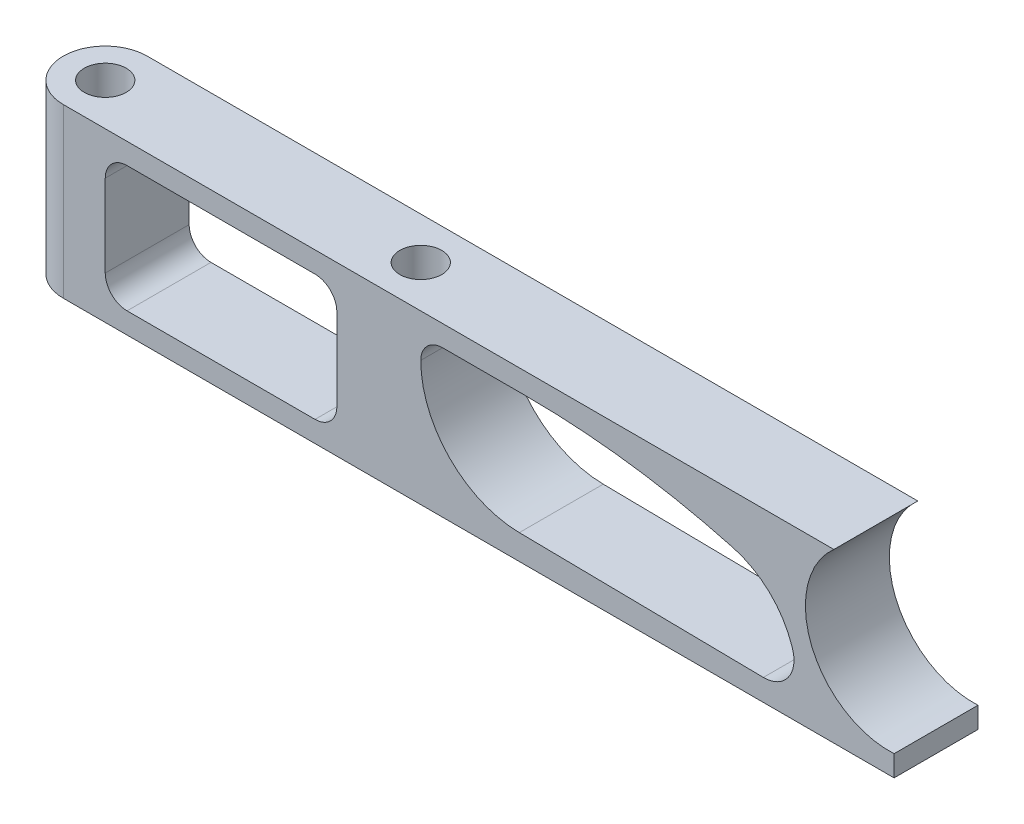
ISO-10303-21;
HEADER;
FILE_DESCRIPTION(('STEP AP214'),'2;1');
FILE_NAME('part.step','',(''),(''),'','','');
FILE_SCHEMA(('AUTOMOTIVE_DESIGN { 1 0 10303 214 1 1 1 1 }'));
ENDSEC;
DATA;
#1=APPLICATION_CONTEXT('core data for automotive mechanical design processes');
#2=APPLICATION_PROTOCOL_DEFINITION('international standard','automotive_design',2000,#1);
#3=PRODUCT_CONTEXT('',#1,'mechanical');
#4=PRODUCT('Part','Part','',(#3));
#5=PRODUCT_RELATED_PRODUCT_CATEGORY('part','',(#4));
#6=PRODUCT_DEFINITION_FORMATION('','',#4);
#7=PRODUCT_DEFINITION_CONTEXT('part definition',#1,'design');
#8=PRODUCT_DEFINITION('design','',#6,#7);
#9=PRODUCT_DEFINITION_SHAPE('','',#8);
#10=(LENGTH_UNIT() NAMED_UNIT(*) SI_UNIT(.MILLI.,.METRE.));
#11=(NAMED_UNIT(*) PLANE_ANGLE_UNIT() SI_UNIT($,.RADIAN.));
#12=(NAMED_UNIT(*) SI_UNIT($,.STERADIAN.) SOLID_ANGLE_UNIT());
#13=UNCERTAINTY_MEASURE_WITH_UNIT(LENGTH_MEASURE(1.E-05),#10,'distance_accuracy_value','');
#14=(GEOMETRIC_REPRESENTATION_CONTEXT(3) GLOBAL_UNCERTAINTY_ASSIGNED_CONTEXT((#13)) GLOBAL_UNIT_ASSIGNED_CONTEXT((#10,
#11,#12)) REPRESENTATION_CONTEXT('',''));
#15=CARTESIAN_POINT('',(0.,0.,0.));
#16=DIRECTION('',(0.,0.,1.));
#17=DIRECTION('',(1.,0.,0.));
#18=AXIS2_PLACEMENT_3D('',#15,#16,#17);
#19=CARTESIAN_POINT('',(0.,0.,12.7));
#20=DIRECTION('',(0.,0.,1.));
#21=DIRECTION('',(1.,0.,0.));
#22=AXIS2_PLACEMENT_3D('',#19,#20,#21);
#23=PLANE('',#22);
#24=DIRECTION('',(-1.,0.,0.));
#25=VECTOR('',#24,1.);
#26=CARTESIAN_POINT('',(-30.1839527027027,11.9142947635135,12.7));
#27=LINE('',#26,#25);
#28=CARTESIAN_POINT('',(94.0565800932726,11.9142947635135,12.7));
#29=VERTEX_POINT('',#28);
#30=CARTESIAN_POINT('',(-22.5639527027027,11.9142947635135,12.7));
#31=VERTEX_POINT('',#30);
#32=EDGE_CURVE('E341',#29,#31,#27,.T.);
#33=ORIENTED_EDGE('',*,*,#32,.T.);
#34=DIRECTION('',(0.,1.,0.));
#35=VECTOR('',#34,1.);
#36=CARTESIAN_POINT('',(-22.5639527027027,-13.4748069239045,12.7));
#37=LINE('',#36,#35);
#38=CARTESIAN_POINT('',(-22.5639527027027,-13.4748069239045,12.7));
#39=VERTEX_POINT('',#38);
#40=EDGE_CURVE('E316',#39,#31,#37,.T.);
#41=ORIENTED_EDGE('',*,*,#40,.F.);
#42=DIRECTION('',(-1.,0.,0.));
#43=VECTOR('',#42,1.);
#44=CARTESIAN_POINT('',(-30.1839527027027,-13.4748069239045,12.7));
#45=LINE('',#44,#43);
#46=CARTESIAN_POINT('',(103.166047297297,-13.4748069239045,12.7));
#47=VERTEX_POINT('',#46);
#48=EDGE_CURVE('E321',#47,#39,#45,.T.);
#49=ORIENTED_EDGE('',*,*,#48,.F.);
#50=DIRECTION('',(0.,1.,0.));
#51=VECTOR('',#50,1.);
#52=CARTESIAN_POINT('',(103.166047297297,11.9142947635135,12.7));
#53=LINE('',#52,#51);
#54=CARTESIAN_POINT('',(103.166047297297,-10.2998069239045,12.7));
#55=VERTEX_POINT('',#54);
#56=EDGE_CURVE('E347',#47,#55,#53,.T.);
#57=ORIENTED_EDGE('',*,*,#56,.T.);
#58=CARTESIAN_POINT('',(102.446023355036,2.37976584186993,12.7));
#59=DIRECTION('',(0.,0.,1.));
#60=DIRECTION('',(1.,0.,0.));
#61=AXIS2_PLACEMENT_3D('',#58,#59,#60);
#62=CIRCLE('',#61,12.7);
#63=EDGE_CURVE('E344',#55,#29,#62,.F.);
#64=ORIENTED_EDGE('',*,*,#63,.T.);
#65=EDGE_LOOP('',(#33,#41,#49,#57,#64));
#66=FACE_BOUND('',#65,.T.);
#67=DIRECTION('',(0.,-1.,0.));
#68=VECTOR('',#67,1.);
#69=CARTESIAN_POINT('',(-16.2139527027027,-6.99780692390455,12.7));
#70=LINE('',#69,#68);
#71=CARTESIAN_POINT('',(-16.2139527027027,5.4372947635135,12.7));
#72=VERTEX_POINT('',#71);
#73=CARTESIAN_POINT('',(-16.2139527027027,-6.99780692390455,12.7));
#74=VERTEX_POINT('',#73);
#75=EDGE_CURVE('E310',#72,#74,#70,.T.);
#76=ORIENTED_EDGE('',*,*,#75,.F.);
#77=CARTESIAN_POINT('',(-12.9119527027027,5.4372947635135,12.7));
#78=DIRECTION('',(0.,0.,1.));
#79=DIRECTION('',(-1.,0.,0.));
#80=AXIS2_PLACEMENT_3D('',#77,#78,#79);
#81=CIRCLE('',#80,3.302);
#82=CARTESIAN_POINT('',(-12.9119527027027,8.7392947635135,12.7));
#83=VERTEX_POINT('',#82);
#84=EDGE_CURVE('E279',#83,#72,#81,.T.);
#85=ORIENTED_EDGE('',*,*,#84,.F.);
#86=DIRECTION('',(-1.,0.,0.));
#87=VECTOR('',#86,1.);
#88=CARTESIAN_POINT('',(-12.9119527027027,8.7392947635135,12.7));
#89=LINE('',#88,#87);
#90=CARTESIAN_POINT('',(15.5360472972973,8.73929476351351,12.7));
#91=VERTEX_POINT('',#90);
#92=EDGE_CURVE('E274',#91,#83,#89,.T.);
#93=ORIENTED_EDGE('',*,*,#92,.F.);
#94=CARTESIAN_POINT('',(15.5360472972973,5.4372947635135,12.7));
#95=DIRECTION('',(0.,0.,1.));
#96=DIRECTION('',(-1.,0.,0.));
#97=AXIS2_PLACEMENT_3D('',#94,#95,#96);
#98=CIRCLE('',#97,3.302);
#99=CARTESIAN_POINT('',(18.8380472972973,5.4372947635135,12.7));
#100=VERTEX_POINT('',#99);
#101=EDGE_CURVE('E300',#100,#91,#98,.T.);
#102=ORIENTED_EDGE('',*,*,#101,.F.);
#103=DIRECTION('',(0.,1.,0.));
#104=VECTOR('',#103,1.);
#105=CARTESIAN_POINT('',(18.8380472972973,5.4372947635135,12.7));
#106=LINE('',#105,#104);
#107=CARTESIAN_POINT('',(18.8380472972973,-6.99780692390455,12.7));
#108=VERTEX_POINT('',#107);
#109=EDGE_CURVE('E302',#108,#100,#106,.T.);
#110=ORIENTED_EDGE('',*,*,#109,.F.);
#111=CARTESIAN_POINT('',(15.5360472972973,-6.99780692390455,12.7));
#112=DIRECTION('',(0.,0.,1.));
#113=DIRECTION('',(-1.,0.,0.));
#114=AXIS2_PLACEMENT_3D('',#111,#112,#113);
#115=CIRCLE('',#114,3.302);
#116=CARTESIAN_POINT('',(15.5360472972973,-10.2998069239046,12.7));
#117=VERTEX_POINT('',#116);
#118=EDGE_CURVE('E304',#117,#108,#115,.T.);
#119=ORIENTED_EDGE('',*,*,#118,.F.);
#120=DIRECTION('',(1.,0.,0.));
#121=VECTOR('',#120,1.);
#122=CARTESIAN_POINT('',(15.5360472972973,-10.2998069239046,12.7));
#123=LINE('',#122,#121);
#124=CARTESIAN_POINT('',(-12.9119527027027,-10.2998069239046,12.7));
#125=VERTEX_POINT('',#124);
#126=EDGE_CURVE('E306',#125,#117,#123,.T.);
#127=ORIENTED_EDGE('',*,*,#126,.F.);
#128=CARTESIAN_POINT('',(-12.9119527027027,-6.99780692390455,12.7));
#129=DIRECTION('',(0.,0.,1.));
#130=DIRECTION('',(-1.,0.,0.));
#131=AXIS2_PLACEMENT_3D('',#128,#129,#130);
#132=CIRCLE('',#131,3.302);
#133=EDGE_CURVE('E308',#74,#125,#132,.T.);
#134=ORIENTED_EDGE('',*,*,#133,.F.);
#135=EDGE_LOOP('',(#76,#85,#93,#102,#110,#119,#127,#134));
#136=FACE_BOUND('',#135,.T.);
#137=CARTESIAN_POINT('',(46.6611345408116,5.43729476351351,12.7));
#138=DIRECTION('',(0.,0.,1.));
#139=DIRECTION('',(1.,0.,0.));
#140=AXIS2_PLACEMENT_3D('',#137,#138,#139);
#141=CIRCLE('',#140,15.1230872435143);
#142=CARTESIAN_POINT('',(31.5380472972973,5.43729476351351,12.7));
#143=VERTEX_POINT('',#142);
#144=CARTESIAN_POINT('',(46.4508885535905,-9.68433095595871,12.7));
#145=VERTEX_POINT('',#144);
#146=EDGE_CURVE('E198',#143,#145,#141,.T.);
#147=ORIENTED_EDGE('',*,*,#146,.F.);
#148=CARTESIAN_POINT('',(34.8400472972973,5.43729476351351,12.7));
#149=DIRECTION('',(0.,0.,1.));
#150=DIRECTION('',(-1.,0.,0.));
#151=AXIS2_PLACEMENT_3D('',#148,#149,#150);
#152=CIRCLE('',#151,3.302);
#153=CARTESIAN_POINT('',(34.8400472972973,8.73929476351351,12.7));
#154=VERTEX_POINT('',#153);
#155=EDGE_CURVE('E188',#154,#143,#152,.T.);
#156=ORIENTED_EDGE('',*,*,#155,.F.);
#157=DIRECTION('',(-1.,0.,0.));
#158=VECTOR('',#157,1.);
#159=CARTESIAN_POINT('',(34.8400472972973,8.73929476351351,12.7));
#160=LINE('',#159,#158);
#161=CARTESIAN_POINT('',(47.3293118483746,8.73929476351351,12.7));
#162=VERTEX_POINT('',#161);
#163=EDGE_CURVE('E223',#162,#154,#160,.T.);
#164=ORIENTED_EDGE('',*,*,#163,.F.);
#165=CARTESIAN_POINT('',(47.3293118483746,-110.62988668612,12.7));
#166=DIRECTION('',(0.,0.,1.));
#167=DIRECTION('',(-1.,0.,0.));
#168=AXIS2_PLACEMENT_3D('',#165,#166,#167);
#169=CIRCLE('',#168,119.369181449633);
#170=CARTESIAN_POINT('',(78.7987085512871,4.51644869243319,12.7));
#171=VERTEX_POINT('',#170);
#172=EDGE_CURVE('E221',#171,#162,#169,.T.);
#173=ORIENTED_EDGE('',*,*,#172,.F.);
#174=CARTESIAN_POINT('',(75.3777675369357,-8.00075413377447,12.7));
#175=DIRECTION('',(0.,0.,1.));
#176=DIRECTION('',(-1.,0.,0.));
#177=AXIS2_PLACEMENT_3D('',#174,#175,#176);
#178=CIRCLE('',#177,12.9762553926814);
#179=CARTESIAN_POINT('',(87.6879743890515,-3.89685217658614,12.7));
#180=VERTEX_POINT('',#179);
#181=EDGE_CURVE('E219',#180,#171,#178,.T.);
#182=ORIENTED_EDGE('',*,*,#181,.F.);
#183=DIRECTION('',(-0.316262421861991,0.948671745398791,0.));
#184=VECTOR('',#183,1.);
#185=CARTESIAN_POINT('',(87.6879743890515,-3.89685217658614,12.7));
#186=LINE('',#185,#184);
#187=CARTESIAN_POINT('',(87.7824661222658,-4.18029286152881,12.7));
#188=VERTEX_POINT('',#187);
#189=EDGE_CURVE('E217',#188,#180,#186,.T.);
#190=ORIENTED_EDGE('',*,*,#189,.F.);
#191=CARTESIAN_POINT('',(83.4451389023025,-5.62624465428155,12.7));
#192=DIRECTION('',(0.,0.,1.));
#193=DIRECTION('',(1.,0.,0.));
#194=AXIS2_PLACEMENT_3D('',#191,#192,#193);
#195=CIRCLE('',#194,4.57200000000001);
#196=CARTESIAN_POINT('',(83.3815774985959,-10.1978028074673,12.7));
#197=VERTEX_POINT('',#196);
#198=EDGE_CURVE('E213',#197,#188,#195,.T.);
#199=ORIENTED_EDGE('',*,*,#198,.F.);
#200=DIRECTION('',(0.999903358089616,-0.0139023192709042,0.));
#201=VECTOR('',#200,1.);
#202=CARTESIAN_POINT('',(46.4508885535905,-9.68433095595871,12.7));
#203=LINE('',#202,#201);
#204=EDGE_CURVE('E211',#145,#197,#203,.T.);
#205=ORIENTED_EDGE('',*,*,#204,.F.);
#206=EDGE_LOOP('',(#147,#156,#164,#173,#182,#190,#199,#205));
#207=FACE_BOUND('',#206,.T.);
#208=ADVANCED_FACE('F43',(#66,#136,#207),#23,.T.);
#209=CARTESIAN_POINT('',(0.,0.,0.));
#210=DIRECTION('',(0.,0.,1.));
#211=DIRECTION('',(1.,0.,0.));
#212=AXIS2_PLACEMENT_3D('',#209,#210,#211);
#213=PLANE('',#212);
#214=CARTESIAN_POINT('',(-12.9119527027027,5.4372947635135,0.));
#215=DIRECTION('',(0.,0.,1.));
#216=DIRECTION('',(-1.,0.,0.));
#217=AXIS2_PLACEMENT_3D('',#214,#215,#216);
#218=CIRCLE('',#217,3.302);
#219=CARTESIAN_POINT('',(-12.9119527027027,8.7392947635135,0.));
#220=VERTEX_POINT('',#219);
#221=CARTESIAN_POINT('',(-16.2139527027027,5.4372947635135,0.));
#222=VERTEX_POINT('',#221);
#223=EDGE_CURVE('E227',#220,#222,#218,.T.);
#224=ORIENTED_EDGE('',*,*,#223,.T.);
#225=DIRECTION('',(0.,-1.,0.));
#226=VECTOR('',#225,1.);
#227=CARTESIAN_POINT('',(-16.2139527027027,-6.99780692390455,0.));
#228=LINE('',#227,#226);
#229=CARTESIAN_POINT('',(-16.2139527027027,-6.99780692390455,0.));
#230=VERTEX_POINT('',#229);
#231=EDGE_CURVE('E294',#222,#230,#228,.T.);
#232=ORIENTED_EDGE('',*,*,#231,.T.);
#233=CARTESIAN_POINT('',(-12.9119527027027,-6.99780692390455,0.));
#234=DIRECTION('',(0.,0.,1.));
#235=DIRECTION('',(-1.,0.,0.));
#236=AXIS2_PLACEMENT_3D('',#233,#234,#235);
#237=CIRCLE('',#236,3.302);
#238=CARTESIAN_POINT('',(-12.9119527027027,-10.2998069239046,0.));
#239=VERTEX_POINT('',#238);
#240=EDGE_CURVE('E291',#230,#239,#237,.T.);
#241=ORIENTED_EDGE('',*,*,#240,.T.);
#242=DIRECTION('',(1.,0.,0.));
#243=VECTOR('',#242,1.);
#244=CARTESIAN_POINT('',(15.5360472972973,-10.2998069239046,0.));
#245=LINE('',#244,#243);
#246=CARTESIAN_POINT('',(15.5360472972973,-10.2998069239046,0.));
#247=VERTEX_POINT('',#246);
#248=EDGE_CURVE('E288',#239,#247,#245,.T.);
#249=ORIENTED_EDGE('',*,*,#248,.T.);
#250=CARTESIAN_POINT('',(15.5360472972973,-6.99780692390455,0.));
#251=DIRECTION('',(0.,0.,1.));
#252=DIRECTION('',(-1.,0.,0.));
#253=AXIS2_PLACEMENT_3D('',#250,#251,#252);
#254=CIRCLE('',#253,3.302);
#255=CARTESIAN_POINT('',(18.8380472972973,-6.99780692390455,0.));
#256=VERTEX_POINT('',#255);
#257=EDGE_CURVE('E285',#247,#256,#254,.T.);
#258=ORIENTED_EDGE('',*,*,#257,.T.);
#259=DIRECTION('',(0.,1.,0.));
#260=VECTOR('',#259,1.);
#261=CARTESIAN_POINT('',(18.8380472972973,5.4372947635135,0.));
#262=LINE('',#261,#260);
#263=CARTESIAN_POINT('',(18.8380472972973,5.4372947635135,0.));
#264=VERTEX_POINT('',#263);
#265=EDGE_CURVE('E282',#256,#264,#262,.T.);
#266=ORIENTED_EDGE('',*,*,#265,.T.);
#267=CARTESIAN_POINT('',(15.5360472972973,5.4372947635135,0.));
#268=DIRECTION('',(0.,0.,1.));
#269=DIRECTION('',(-1.,0.,0.));
#270=AXIS2_PLACEMENT_3D('',#267,#268,#269);
#271=CIRCLE('',#270,3.302);
#272=CARTESIAN_POINT('',(15.5360472972973,8.7392947635135,0.));
#273=VERTEX_POINT('',#272);
#274=EDGE_CURVE('E278',#264,#273,#271,.T.);
#275=ORIENTED_EDGE('',*,*,#274,.T.);
#276=DIRECTION('',(-1.,0.,0.));
#277=VECTOR('',#276,1.);
#278=CARTESIAN_POINT('',(-12.9119527027027,8.7392947635135,0.));
#279=LINE('',#278,#277);
#280=EDGE_CURVE('E275',#273,#220,#279,.T.);
#281=ORIENTED_EDGE('',*,*,#280,.T.);
#282=EDGE_LOOP('',(#224,#232,#241,#249,#258,#266,#275,#281));
#283=FACE_BOUND('',#282,.T.);
#284=DIRECTION('',(0.,1.,0.));
#285=VECTOR('',#284,1.);
#286=CARTESIAN_POINT('',(-22.5639527027027,-13.4748069239045,0.));
#287=LINE('',#286,#285);
#288=CARTESIAN_POINT('',(-22.5639527027027,-13.4748069239045,0.));
#289=VERTEX_POINT('',#288);
#290=CARTESIAN_POINT('',(-22.5639527027027,11.9142947635135,0.));
#291=VERTEX_POINT('',#290);
#292=EDGE_CURVE('E318',#289,#291,#287,.T.);
#293=ORIENTED_EDGE('',*,*,#292,.T.);
#294=DIRECTION('',(-1.,0.,0.));
#295=VECTOR('',#294,1.);
#296=CARTESIAN_POINT('',(-30.1839527027027,11.9142947635135,0.));
#297=LINE('',#296,#295);
#298=CARTESIAN_POINT('',(94.0565800932726,11.9142947635135,0.));
#299=VERTEX_POINT('',#298);
#300=EDGE_CURVE('E353',#299,#291,#297,.T.);
#301=ORIENTED_EDGE('',*,*,#300,.F.);
#302=CARTESIAN_POINT('',(102.446023355036,2.37976584186993,0.));
#303=DIRECTION('',(0.,0.,1.));
#304=DIRECTION('',(1.,0.,0.));
#305=AXIS2_PLACEMENT_3D('',#302,#303,#304);
#306=CIRCLE('',#305,12.7);
#307=CARTESIAN_POINT('',(103.166047297297,-10.2998069239045,0.));
#308=VERTEX_POINT('',#307);
#309=EDGE_CURVE('E52',#308,#299,#306,.F.);
#310=ORIENTED_EDGE('',*,*,#309,.F.);
#311=DIRECTION('',(0.,1.,0.));
#312=VECTOR('',#311,1.);
#313=CARTESIAN_POINT('',(103.166047297297,11.9142947635135,0.));
#314=LINE('',#313,#312);
#315=CARTESIAN_POINT('',(103.166047297297,-13.4748069239045,0.));
#316=VERTEX_POINT('',#315);
#317=EDGE_CURVE('E334',#316,#308,#314,.T.);
#318=ORIENTED_EDGE('',*,*,#317,.F.);
#319=DIRECTION('',(-1.,0.,0.));
#320=VECTOR('',#319,1.);
#321=CARTESIAN_POINT('',(-30.1839527027027,-13.4748069239045,0.));
#322=LINE('',#321,#320);
#323=EDGE_CURVE('E323',#316,#289,#322,.T.);
#324=ORIENTED_EDGE('',*,*,#323,.T.);
#325=EDGE_LOOP('',(#293,#301,#310,#318,#324));
#326=FACE_BOUND('',#325,.T.);
#327=CARTESIAN_POINT('',(34.8400472972973,5.43729476351351,0.));
#328=DIRECTION('',(0.,0.,1.));
#329=DIRECTION('',(-1.,0.,0.));
#330=AXIS2_PLACEMENT_3D('',#327,#328,#329);
#331=CIRCLE('',#330,3.302);
#332=CARTESIAN_POINT('',(34.8400472972973,8.73929476351351,0.));
#333=VERTEX_POINT('',#332);
#334=CARTESIAN_POINT('',(31.5380472972973,5.43729476351351,0.));
#335=VERTEX_POINT('',#334);
#336=EDGE_CURVE('E225',#333,#335,#331,.T.);
#337=ORIENTED_EDGE('',*,*,#336,.T.);
#338=CARTESIAN_POINT('',(46.6611345408116,5.43729476351351,0.));
#339=DIRECTION('',(0.,0.,1.));
#340=DIRECTION('',(1.,0.,0.));
#341=AXIS2_PLACEMENT_3D('',#338,#339,#340);
#342=CIRCLE('',#341,15.1230872435143);
#343=CARTESIAN_POINT('',(46.4508885535905,-9.68433095595871,0.));
#344=VERTEX_POINT('',#343);
#345=EDGE_CURVE('E205',#335,#344,#342,.T.);
#346=ORIENTED_EDGE('',*,*,#345,.T.);
#347=DIRECTION('',(0.999903358089616,-0.0139023192709042,0.));
#348=VECTOR('',#347,1.);
#349=CARTESIAN_POINT('',(46.4508885535905,-9.68433095595871,0.));
#350=LINE('',#349,#348);
#351=CARTESIAN_POINT('',(83.3815774985959,-10.1978028074673,0.));
#352=VERTEX_POINT('',#351);
#353=EDGE_CURVE('E229',#344,#352,#350,.T.);
#354=ORIENTED_EDGE('',*,*,#353,.T.);
#355=CARTESIAN_POINT('',(83.4451389023025,-5.62624465428155,0.));
#356=DIRECTION('',(0.,0.,1.));
#357=DIRECTION('',(1.,0.,0.));
#358=AXIS2_PLACEMENT_3D('',#355,#356,#357);
#359=CIRCLE('',#358,4.57200000000001);
#360=CARTESIAN_POINT('',(87.7824661222658,-4.18029286152881,0.));
#361=VERTEX_POINT('',#360);
#362=EDGE_CURVE('E232',#352,#361,#359,.T.);
#363=ORIENTED_EDGE('',*,*,#362,.T.);
#364=DIRECTION('',(-0.316262421861991,0.948671745398791,0.));
#365=VECTOR('',#364,1.);
#366=CARTESIAN_POINT('',(87.6879743890515,-3.89685217658614,0.));
#367=LINE('',#366,#365);
#368=CARTESIAN_POINT('',(87.6879743890515,-3.89685217658614,0.));
#369=VERTEX_POINT('',#368);
#370=EDGE_CURVE('E235',#361,#369,#367,.T.);
#371=ORIENTED_EDGE('',*,*,#370,.T.);
#372=CARTESIAN_POINT('',(75.3777675369357,-8.00075413377447,0.));
#373=DIRECTION('',(0.,0.,1.));
#374=DIRECTION('',(-1.,0.,0.));
#375=AXIS2_PLACEMENT_3D('',#372,#373,#374);
#376=CIRCLE('',#375,12.9762553926814);
#377=CARTESIAN_POINT('',(78.7987085512871,4.51644869243319,0.));
#378=VERTEX_POINT('',#377);
#379=EDGE_CURVE('E238',#369,#378,#376,.T.);
#380=ORIENTED_EDGE('',*,*,#379,.T.);
#381=CARTESIAN_POINT('',(47.3293118483746,-110.62988668612,0.));
#382=DIRECTION('',(0.,0.,1.));
#383=DIRECTION('',(-1.,0.,0.));
#384=AXIS2_PLACEMENT_3D('',#381,#382,#383);
#385=CIRCLE('',#384,119.369181449633);
#386=CARTESIAN_POINT('',(47.3293118483746,8.73929476351351,0.));
#387=VERTEX_POINT('',#386);
#388=EDGE_CURVE('E241',#378,#387,#385,.T.);
#389=ORIENTED_EDGE('',*,*,#388,.T.);
#390=DIRECTION('',(-1.,0.,0.));
#391=VECTOR('',#390,1.);
#392=CARTESIAN_POINT('',(34.8400472972973,8.73929476351351,0.));
#393=LINE('',#392,#391);
#394=EDGE_CURVE('E199',#387,#333,#393,.T.);
#395=ORIENTED_EDGE('',*,*,#394,.T.);
#396=EDGE_LOOP('',(#337,#346,#354,#363,#371,#380,#389,#395));
#397=FACE_BOUND('',#396,.T.);
#398=ADVANCED_FACE('F366',(#283,#326,#397),#213,.F.);
#399=CARTESIAN_POINT('',(-30.1839527027027,11.9142947635135,12.7));
#400=DIRECTION('',(0.,-1.,0.));
#401=DIRECTION('',(0.,0.,-1.));
#402=AXIS2_PLACEMENT_3D('',#399,#400,#401);
#403=PLANE('',#402);
#404=CARTESIAN_POINT('',(-22.5639527027027,11.9142947635135,6.35));
#405=DIRECTION('',(0.,1.,0.));
#406=DIRECTION('',(0.,0.,1.));
#407=AXIS2_PLACEMENT_3D('',#404,#405,#406);
#408=CIRCLE('',#407,3.175);
#409=CARTESIAN_POINT('',(-22.5639527027027,11.9142947635135,9.525));
#410=VERTEX_POINT('',#409);
#411=EDGE_CURVE('E340',#410,#410,#408,.T.);
#412=ORIENTED_EDGE('',*,*,#411,.F.);
#413=EDGE_LOOP('',(#412));
#414=FACE_BOUND('',#413,.T.);
#415=CARTESIAN_POINT('',(25.1880472972973,11.9142947635135,6.35));
#416=DIRECTION('',(0.,1.,0.));
#417=DIRECTION('',(0.,0.,1.));
#418=AXIS2_PLACEMENT_3D('',#415,#416,#417);
#419=CIRCLE('',#418,3.175);
#420=CARTESIAN_POINT('',(25.1880472972973,11.9142947635135,9.525));
#421=VERTEX_POINT('',#420);
#422=EDGE_CURVE('E337',#421,#421,#419,.T.);
#423=ORIENTED_EDGE('',*,*,#422,.F.);
#424=EDGE_LOOP('',(#423));
#425=FACE_BOUND('',#424,.T.);
#426=ORIENTED_EDGE('',*,*,#300,.T.);
#427=CARTESIAN_POINT('',(-22.5639527027027,11.9142947635135,6.35));
#428=DIRECTION('',(0.,-1.,0.));
#429=DIRECTION('',(0.,0.,-1.));
#430=AXIS2_PLACEMENT_3D('',#427,#428,#429);
#431=CIRCLE('',#430,6.35);
#432=EDGE_CURVE('E206',#31,#291,#431,.T.);
#433=ORIENTED_EDGE('',*,*,#432,.F.);
#434=ORIENTED_EDGE('',*,*,#32,.F.);
#435=DIRECTION('',(0.,0.,1.));
#436=VECTOR('',#435,1.);
#437=CARTESIAN_POINT('',(94.0565800932725,11.9142947635135,-327.293263145336));
#438=LINE('',#437,#436);
#439=EDGE_CURVE('E11',#299,#29,#438,.T.);
#440=ORIENTED_EDGE('',*,*,#439,.F.);
#441=EDGE_LOOP('',(#426,#433,#434,#440));
#442=FACE_BOUND('',#441,.T.);
#443=ADVANCED_FACE('F370',(#414,#425,#442),#403,.F.);
#444=CARTESIAN_POINT('',(-30.1839527027027,-13.4748069239045,0.));
#445=DIRECTION('',(0.,1.,0.));
#446=DIRECTION('',(0.,0.,1.));
#447=AXIS2_PLACEMENT_3D('',#444,#445,#446);
#448=PLANE('',#447);
#449=CARTESIAN_POINT('',(-22.5639527027027,-13.4748069239045,6.35));
#450=DIRECTION('',(0.,1.,0.));
#451=DIRECTION('',(0.,0.,1.));
#452=AXIS2_PLACEMENT_3D('',#449,#450,#451);
#453=CIRCLE('',#452,3.175);
#454=CARTESIAN_POINT('',(-22.5639527027027,-13.4748069239046,9.525));
#455=VERTEX_POINT('',#454);
#456=EDGE_CURVE('E47',#455,#455,#453,.F.);
#457=ORIENTED_EDGE('',*,*,#456,.F.);
#458=EDGE_LOOP('',(#457));
#459=FACE_BOUND('',#458,.T.);
#460=CARTESIAN_POINT('',(25.1880472972973,-13.4748069239045,6.35));
#461=DIRECTION('',(0.,1.,0.));
#462=DIRECTION('',(0.,0.,1.));
#463=AXIS2_PLACEMENT_3D('',#460,#461,#462);
#464=CIRCLE('',#463,3.175);
#465=CARTESIAN_POINT('',(25.1880472972973,-13.4748069239046,9.525));
#466=VERTEX_POINT('',#465);
#467=EDGE_CURVE('E328',#466,#466,#464,.F.);
#468=ORIENTED_EDGE('',*,*,#467,.F.);
#469=EDGE_LOOP('',(#468));
#470=FACE_BOUND('',#469,.T.);
#471=ORIENTED_EDGE('',*,*,#48,.T.);
#472=CARTESIAN_POINT('',(-22.5639527027027,-13.4748069239045,6.35));
#473=DIRECTION('',(0.,-1.,0.));
#474=DIRECTION('',(0.,0.,-1.));
#475=AXIS2_PLACEMENT_3D('',#472,#473,#474);
#476=CIRCLE('',#475,6.35);
#477=EDGE_CURVE('E313',#39,#289,#476,.T.);
#478=ORIENTED_EDGE('',*,*,#477,.T.);
#479=ORIENTED_EDGE('',*,*,#323,.F.);
#480=DIRECTION('',(0.,0.,-1.));
#481=VECTOR('',#480,1.);
#482=CARTESIAN_POINT('',(103.166047297297,-13.4748069239045,12.7));
#483=LINE('',#482,#481);
#484=EDGE_CURVE('E331',#47,#316,#483,.T.);
#485=ORIENTED_EDGE('',*,*,#484,.F.);
#486=EDGE_LOOP('',(#471,#478,#479,#485));
#487=FACE_BOUND('',#486,.T.);
#488=ADVANCED_FACE('F377',(#459,#470,#487),#448,.F.);
#489=CARTESIAN_POINT('',(103.166047297297,11.9142947635135,12.7));
#490=DIRECTION('',(-1.,0.,0.));
#491=DIRECTION('',(0.,0.,1.));
#492=AXIS2_PLACEMENT_3D('',#489,#490,#491);
#493=PLANE('',#492);
#494=ORIENTED_EDGE('',*,*,#56,.F.);
#495=ORIENTED_EDGE('',*,*,#484,.T.);
#496=ORIENTED_EDGE('',*,*,#317,.T.);
#497=DIRECTION('',(0.,0.,1.));
#498=VECTOR('',#497,1.);
#499=CARTESIAN_POINT('',(103.166047297297,-10.2998069239045,-327.293263145336));
#500=LINE('',#499,#498);
#501=EDGE_CURVE('E336',#55,#308,#500,.F.);
#502=ORIENTED_EDGE('',*,*,#501,.F.);
#503=EDGE_LOOP('',(#494,#495,#496,#502));
#504=FACE_BOUND('',#503,.T.);
#505=ADVANCED_FACE('F45',(#504),#493,.F.);
#506=CARTESIAN_POINT('',(25.1880472972973,-26.1857052364865,6.35));
#507=DIRECTION('',(0.,1.,0.));
#508=DIRECTION('',(0.,0.,1.));
#509=AXIS2_PLACEMENT_3D('',#506,#507,#508);
#510=CYLINDRICAL_SURFACE('',#509,3.175);
#511=CARTESIAN_POINT('',(25.1880472972973,-13.4748069239046,9.525));
#512=CARTESIAN_POINT('',(25.1880472972973,-13.2103371146606,9.525));
#513=CARTESIAN_POINT('',(25.1880472972973,-12.9458673054167,9.525));
#514=CARTESIAN_POINT('',(25.1880472972973,-12.4169276869288,9.525));
#515=CARTESIAN_POINT('',(25.1880472972973,-12.1524578776849,9.525));
#516=CARTESIAN_POINT('',(25.1880472972973,-11.623518259197,9.525));
#517=CARTESIAN_POINT('',(25.1880472972973,-11.359048449953,9.525));
#518=CARTESIAN_POINT('',(25.1880472972973,-10.8301088314652,9.525));
#519=CARTESIAN_POINT('',(25.1880472972973,-10.5656390222212,9.525));
#520=CARTESIAN_POINT('',(25.1880472972973,-10.0366994037334,9.525));
#521=CARTESIAN_POINT('',(25.1880472972973,-9.77222959448942,9.525));
#522=CARTESIAN_POINT('',(25.1880472972973,-9.24328997600154,9.525));
#523=CARTESIAN_POINT('',(25.1880472972973,-8.9788201667576,9.525));
#524=CARTESIAN_POINT('',(25.1880472972973,-8.44988054826973,9.525));
#525=CARTESIAN_POINT('',(25.1880472972973,-8.18541073902579,9.525));
#526=CARTESIAN_POINT('',(25.1880472972973,-7.65647112053791,9.525));
#527=CARTESIAN_POINT('',(25.1880472972973,-7.39200131129397,9.525));
#528=CARTESIAN_POINT('',(25.1880472972973,-6.8630616928061,9.525));
#529=CARTESIAN_POINT('',(25.1880472972973,-6.59859188356216,9.525));
#530=CARTESIAN_POINT('',(25.1880472972973,-6.06965226507428,9.525));
#531=CARTESIAN_POINT('',(25.1880472972973,-5.80518245583035,9.525));
#532=CARTESIAN_POINT('',(25.1880472972973,-5.27624283734247,9.525));
#533=CARTESIAN_POINT('',(25.1880472972973,-5.01177302809853,9.525));
#534=CARTESIAN_POINT('',(25.1880472972973,-4.48283340961065,9.525));
#535=CARTESIAN_POINT('',(25.1880472972973,-4.21836360036672,9.525));
#536=CARTESIAN_POINT('',(25.1880472972973,-3.68942398187884,9.525));
#537=CARTESIAN_POINT('',(25.1880472972973,-3.4249541726349,9.525));
#538=CARTESIAN_POINT('',(25.1880472972973,-2.89601455414703,9.525));
#539=CARTESIAN_POINT('',(25.1880472972973,-2.63154474490309,9.525));
#540=CARTESIAN_POINT('',(25.1880472972973,-2.10260512641521,9.525));
#541=CARTESIAN_POINT('',(25.1880472972973,-1.83813531717127,9.525));
#542=CARTESIAN_POINT('',(25.1880472972973,-1.3091956986834,9.525));
#543=CARTESIAN_POINT('',(25.1880472972973,-1.04472588943946,9.525));
#544=CARTESIAN_POINT('',(25.1880472972973,-0.515786270951582,9.525));
#545=CARTESIAN_POINT('',(25.1880472972973,-0.251316461707645,9.525));
#546=CARTESIAN_POINT('',(25.1880472972973,0.277623156780231,9.525));
#547=CARTESIAN_POINT('',(25.1880472972973,0.542092966024169,9.525));
#548=CARTESIAN_POINT('',(25.1880472972973,1.07103258451205,9.525));
#549=CARTESIAN_POINT('',(25.1880472972973,1.33550239375598,9.525));
#550=CARTESIAN_POINT('',(25.1880472972973,1.86444201224386,9.525));
#551=CARTESIAN_POINT('',(25.1880472972973,2.1289118214878,9.525));
#552=CARTESIAN_POINT('',(25.1880472972973,2.65785143997568,9.525));
#553=CARTESIAN_POINT('',(25.1880472972973,2.92232124921961,9.525));
#554=CARTESIAN_POINT('',(25.1880472972973,3.45126086770749,9.525));
#555=CARTESIAN_POINT('',(25.1880472972973,3.71573067695143,9.525));
#556=CARTESIAN_POINT('',(25.1880472972973,4.24467029543931,9.525));
#557=CARTESIAN_POINT('',(25.1880472972973,4.50914010468324,9.525));
#558=CARTESIAN_POINT('',(25.1880472972973,5.03807972317112,9.525));
#559=CARTESIAN_POINT('',(25.1880472972973,5.30254953241506,9.525));
#560=CARTESIAN_POINT('',(25.1880472972973,5.83148915090293,9.525));
#561=CARTESIAN_POINT('',(25.1880472972973,6.09595896014687,9.525));
#562=CARTESIAN_POINT('',(25.1880472972973,6.62489857863474,9.525));
#563=CARTESIAN_POINT('',(25.1880472972973,6.88936838787868,9.525));
#564=CARTESIAN_POINT('',(25.1880472972973,7.41830800636656,9.525));
#565=CARTESIAN_POINT('',(25.1880472972973,7.6827778156105,9.525));
#566=CARTESIAN_POINT('',(25.1880472972973,8.21171743409838,9.525));
#567=CARTESIAN_POINT('',(25.1880472972973,8.47618724334231,9.525));
#568=CARTESIAN_POINT('',(25.1880472972973,9.00512686183019,9.525));
#569=CARTESIAN_POINT('',(25.1880472972973,9.26959667107413,9.525));
#570=CARTESIAN_POINT('',(25.1880472972973,9.798536289562,9.525));
#571=CARTESIAN_POINT('',(25.1880472972973,10.0630060988059,9.525));
#572=CARTESIAN_POINT('',(25.1880472972973,10.5919457172938,9.525));
#573=CARTESIAN_POINT('',(25.1880472972973,10.8564155265378,9.525));
#574=CARTESIAN_POINT('',(25.1880472972973,11.3853551450256,9.525));
#575=CARTESIAN_POINT('',(25.1880472972973,11.6498249542696,9.525));
#576=CARTESIAN_POINT('',(25.1880472972973,11.9142947635135,9.525));
#577=B_SPLINE_CURVE_WITH_KNOTS('',3,(#511,#512,#513,#514,#515,#516,#517,#518,#519,#520,#521,
#522,#523,#524,#525,#526,#527,#528,#529,#530,#531,#532,#533,#534,#535,#536,#537,#538,#539,#540,
#541,#542,#543,#544,#545,#546,#547,#548,#549,#550,#551,#552,#553,#554,#555,#556,#557,#558,#559,
#560,#561,#562,#563,#564,#565,#566,#567,#568,#569,#570,#571,#572,#573,#574,#575,#576),
.UNSPECIFIED.,.F.,.F.,(4,2,2,2,2,2,2,2,2,2,2,2,2,2,2,2,2,2,2,2,2,2,2,2,2,2,2,2,2,2,2,2,4),(0.,
0.793409427731814,1.58681885546363,2.38022828319544,3.17363771092726,3.96704713865907,
4.76045656639089,5.5538659941227,6.34727542185451,7.14068484958633,7.93409427731814,
8.72750370504996,9.52091313278177,10.3143225605136,11.1077319882454,11.9011414159772,
12.694550843709,13.4879602714408,14.2813696991727,15.0747791269045,15.8681885546363,
16.6615979823681,17.4550074100999,18.2484168378317,19.0418262655635,19.8352356932954,
20.6286451210272,21.422054548759,22.2154639764908,23.0088734042226,23.8022828319544,
24.5956922596862,25.3891016874181),.UNSPECIFIED.);
#578=EDGE_CURVE('BSEAM413',#466,#421,#577,.T.);
#579=ORIENTED_EDGE('',*,*,#467,.T.);
#580=ORIENTED_EDGE('',*,*,#422,.T.);
#581=ORIENTED_EDGE('',*,*,#578,.T.);
#582=ORIENTED_EDGE('',*,*,#578,.F.);
#583=EDGE_LOOP('',(#579,#581,#580,#582));
#584=FACE_BOUND('',#583,.T.);
#585=ADVANCED_FACE('F413',(#584),#510,.F.);
#586=CARTESIAN_POINT('',(-22.5639527027027,-26.1857052364865,6.35));
#587=DIRECTION('',(0.,1.,0.));
#588=DIRECTION('',(0.,0.,1.));
#589=AXIS2_PLACEMENT_3D('',#586,#587,#588);
#590=CYLINDRICAL_SURFACE('',#589,3.175);
#591=CARTESIAN_POINT('',(-22.5639527027027,-13.4748069239046,9.525));
#592=CARTESIAN_POINT('',(-22.5639527027027,-13.2103371146606,9.525));
#593=CARTESIAN_POINT('',(-22.5639527027027,-12.9458673054167,9.525));
#594=CARTESIAN_POINT('',(-22.5639527027027,-12.4169276869288,9.525));
#595=CARTESIAN_POINT('',(-22.5639527027027,-12.1524578776849,9.525));
#596=CARTESIAN_POINT('',(-22.5639527027027,-11.623518259197,9.525));
#597=CARTESIAN_POINT('',(-22.5639527027027,-11.359048449953,9.525));
#598=CARTESIAN_POINT('',(-22.5639527027027,-10.8301088314652,9.525));
#599=CARTESIAN_POINT('',(-22.5639527027027,-10.5656390222212,9.525));
#600=CARTESIAN_POINT('',(-22.5639527027027,-10.0366994037334,9.525));
#601=CARTESIAN_POINT('',(-22.5639527027027,-9.77222959448942,9.525));
#602=CARTESIAN_POINT('',(-22.5639527027027,-9.24328997600154,9.525));
#603=CARTESIAN_POINT('',(-22.5639527027027,-8.9788201667576,9.525));
#604=CARTESIAN_POINT('',(-22.5639527027027,-8.44988054826973,9.525));
#605=CARTESIAN_POINT('',(-22.5639527027027,-8.18541073902579,9.525));
#606=CARTESIAN_POINT('',(-22.5639527027027,-7.65647112053791,9.525));
#607=CARTESIAN_POINT('',(-22.5639527027027,-7.39200131129397,9.525));
#608=CARTESIAN_POINT('',(-22.5639527027027,-6.8630616928061,9.525));
#609=CARTESIAN_POINT('',(-22.5639527027027,-6.59859188356216,9.525));
#610=CARTESIAN_POINT('',(-22.5639527027027,-6.06965226507428,9.525));
#611=CARTESIAN_POINT('',(-22.5639527027027,-5.80518245583035,9.525));
#612=CARTESIAN_POINT('',(-22.5639527027027,-5.27624283734247,9.525));
#613=CARTESIAN_POINT('',(-22.5639527027027,-5.01177302809853,9.525));
#614=CARTESIAN_POINT('',(-22.5639527027027,-4.48283340961065,9.525));
#615=CARTESIAN_POINT('',(-22.5639527027027,-4.21836360036672,9.525));
#616=CARTESIAN_POINT('',(-22.5639527027027,-3.68942398187884,9.525));
#617=CARTESIAN_POINT('',(-22.5639527027027,-3.4249541726349,9.525));
#618=CARTESIAN_POINT('',(-22.5639527027027,-2.89601455414703,9.525));
#619=CARTESIAN_POINT('',(-22.5639527027027,-2.63154474490309,9.525));
#620=CARTESIAN_POINT('',(-22.5639527027027,-2.10260512641521,9.525));
#621=CARTESIAN_POINT('',(-22.5639527027027,-1.83813531717127,9.525));
#622=CARTESIAN_POINT('',(-22.5639527027027,-1.3091956986834,9.525));
#623=CARTESIAN_POINT('',(-22.5639527027027,-1.04472588943946,9.525));
#624=CARTESIAN_POINT('',(-22.5639527027027,-0.515786270951582,9.525));
#625=CARTESIAN_POINT('',(-22.5639527027027,-0.251316461707645,9.525));
#626=CARTESIAN_POINT('',(-22.5639527027027,0.277623156780231,9.525));
#627=CARTESIAN_POINT('',(-22.5639527027027,0.542092966024169,9.525));
#628=CARTESIAN_POINT('',(-22.5639527027027,1.07103258451205,9.525));
#629=CARTESIAN_POINT('',(-22.5639527027027,1.33550239375598,9.525));
#630=CARTESIAN_POINT('',(-22.5639527027027,1.86444201224386,9.525));
#631=CARTESIAN_POINT('',(-22.5639527027027,2.1289118214878,9.525));
#632=CARTESIAN_POINT('',(-22.5639527027027,2.65785143997568,9.525));
#633=CARTESIAN_POINT('',(-22.5639527027027,2.92232124921961,9.525));
#634=CARTESIAN_POINT('',(-22.5639527027027,3.45126086770749,9.525));
#635=CARTESIAN_POINT('',(-22.5639527027027,3.71573067695143,9.525));
#636=CARTESIAN_POINT('',(-22.5639527027027,4.24467029543931,9.525));
#637=CARTESIAN_POINT('',(-22.5639527027027,4.50914010468324,9.525));
#638=CARTESIAN_POINT('',(-22.5639527027027,5.03807972317112,9.525));
#639=CARTESIAN_POINT('',(-22.5639527027027,5.30254953241506,9.525));
#640=CARTESIAN_POINT('',(-22.5639527027027,5.83148915090293,9.525));
#641=CARTESIAN_POINT('',(-22.5639527027027,6.09595896014687,9.525));
#642=CARTESIAN_POINT('',(-22.5639527027027,6.62489857863474,9.525));
#643=CARTESIAN_POINT('',(-22.5639527027027,6.88936838787868,9.525));
#644=CARTESIAN_POINT('',(-22.5639527027027,7.41830800636656,9.525));
#645=CARTESIAN_POINT('',(-22.5639527027027,7.6827778156105,9.525));
#646=CARTESIAN_POINT('',(-22.5639527027027,8.21171743409838,9.525));
#647=CARTESIAN_POINT('',(-22.5639527027027,8.47618724334231,9.525));
#648=CARTESIAN_POINT('',(-22.5639527027027,9.00512686183019,9.525));
#649=CARTESIAN_POINT('',(-22.5639527027027,9.26959667107413,9.525));
#650=CARTESIAN_POINT('',(-22.5639527027027,9.798536289562,9.525));
#651=CARTESIAN_POINT('',(-22.5639527027027,10.0630060988059,9.525));
#652=CARTESIAN_POINT('',(-22.5639527027027,10.5919457172938,9.525));
#653=CARTESIAN_POINT('',(-22.5639527027027,10.8564155265378,9.525));
#654=CARTESIAN_POINT('',(-22.5639527027027,11.3853551450256,9.525));
#655=CARTESIAN_POINT('',(-22.5639527027027,11.6498249542696,9.525));
#656=CARTESIAN_POINT('',(-22.5639527027027,11.9142947635135,9.525));
#657=B_SPLINE_CURVE_WITH_KNOTS('',3,(#591,#592,#593,#594,#595,#596,#597,#598,#599,#600,#601,
#602,#603,#604,#605,#606,#607,#608,#609,#610,#611,#612,#613,#614,#615,#616,#617,#618,#619,#620,
#621,#622,#623,#624,#625,#626,#627,#628,#629,#630,#631,#632,#633,#634,#635,#636,#637,#638,#639,
#640,#641,#642,#643,#644,#645,#646,#647,#648,#649,#650,#651,#652,#653,#654,#655,#656),
.UNSPECIFIED.,.F.,.F.,(4,2,2,2,2,2,2,2,2,2,2,2,2,2,2,2,2,2,2,2,2,2,2,2,2,2,2,2,2,2,2,2,4),(0.,
0.793409427731814,1.58681885546363,2.38022828319544,3.17363771092726,3.96704713865907,
4.76045656639089,5.5538659941227,6.34727542185451,7.14068484958633,7.93409427731814,
8.72750370504996,9.52091313278177,10.3143225605136,11.1077319882454,11.9011414159772,
12.694550843709,13.4879602714408,14.2813696991727,15.0747791269045,15.8681885546363,
16.6615979823681,17.4550074100999,18.2484168378317,19.0418262655635,19.8352356932954,
20.6286451210272,21.422054548759,22.2154639764908,23.0088734042226,23.8022828319544,
24.5956922596862,25.3891016874181),.UNSPECIFIED.);
#658=EDGE_CURVE('BSEAM392',#455,#410,#657,.T.);
#659=ORIENTED_EDGE('',*,*,#456,.T.);
#660=ORIENTED_EDGE('',*,*,#411,.T.);
#661=ORIENTED_EDGE('',*,*,#658,.T.);
#662=ORIENTED_EDGE('',*,*,#658,.F.);
#663=EDGE_LOOP('',(#659,#661,#660,#662));
#664=FACE_BOUND('',#663,.T.);
#665=ADVANCED_FACE('F392',(#664),#590,.F.);
#666=CARTESIAN_POINT('',(102.446023355036,2.37976584186993,-327.293263145336));
#667=DIRECTION('',(0.,0.,1.));
#668=DIRECTION('',(1.,0.,0.));
#669=AXIS2_PLACEMENT_3D('',#666,#667,#668);
#670=CYLINDRICAL_SURFACE('',#669,12.7);
#671=ORIENTED_EDGE('',*,*,#501,.T.);
#672=ORIENTED_EDGE('',*,*,#309,.T.);
#673=ORIENTED_EDGE('',*,*,#439,.T.);
#674=ORIENTED_EDGE('',*,*,#63,.F.);
#675=EDGE_LOOP('',(#671,#672,#673,#674));
#676=FACE_BOUND('',#675,.T.);
#677=ADVANCED_FACE('F363',(#676),#670,.F.);
#678=CARTESIAN_POINT('',(-22.5639527027027,-13.4748069239045,6.35));
#679=DIRECTION('',(0.,1.,0.));
#680=DIRECTION('',(0.,0.,1.));
#681=AXIS2_PLACEMENT_3D('',#678,#679,#680);
#682=CYLINDRICAL_SURFACE('',#681,6.35);
#683=ORIENTED_EDGE('',*,*,#432,.T.);
#684=ORIENTED_EDGE('',*,*,#292,.F.);
#685=ORIENTED_EDGE('',*,*,#477,.F.);
#686=ORIENTED_EDGE('',*,*,#40,.T.);
#687=EDGE_LOOP('',(#683,#684,#685,#686));
#688=FACE_BOUND('',#687,.T.);
#689=ADVANCED_FACE('F379',(#688),#682,.T.);
#690=CARTESIAN_POINT('',(-12.9119527027027,5.4372947635135,12.7));
#691=DIRECTION('',(0.,0.,-1.));
#692=DIRECTION('',(-1.,0.,0.));
#693=AXIS2_PLACEMENT_3D('',#690,#691,#692);
#694=CYLINDRICAL_SURFACE('',#693,3.302);
#695=ORIENTED_EDGE('',*,*,#223,.F.);
#696=DIRECTION('',(0.,0.,-1.));
#697=VECTOR('',#696,1.);
#698=CARTESIAN_POINT('',(-12.9119527027027,8.7392947635135,12.7));
#699=LINE('',#698,#697);
#700=EDGE_CURVE('E271',#83,#220,#699,.T.);
#701=ORIENTED_EDGE('',*,*,#700,.F.);
#702=ORIENTED_EDGE('',*,*,#84,.T.);
#703=DIRECTION('',(0.,0.,-1.));
#704=VECTOR('',#703,1.);
#705=CARTESIAN_POINT('',(-16.2139527027027,5.4372947635135,12.7));
#706=LINE('',#705,#704);
#707=EDGE_CURVE('E257',#72,#222,#706,.T.);
#708=ORIENTED_EDGE('',*,*,#707,.T.);
#709=EDGE_LOOP('',(#695,#701,#702,#708));
#710=FACE_BOUND('',#709,.T.);
#711=ADVANCED_FACE('F381',(#710),#694,.F.);
#712=CARTESIAN_POINT('',(-16.2139527027027,-6.99780692390455,12.7));
#713=DIRECTION('',(1.,0.,0.));
#714=DIRECTION('',(0.,1.,0.));
#715=AXIS2_PLACEMENT_3D('',#712,#713,#714);
#716=PLANE('',#715);
#717=ORIENTED_EDGE('',*,*,#231,.F.);
#718=ORIENTED_EDGE('',*,*,#707,.F.);
#719=ORIENTED_EDGE('',*,*,#75,.T.);
#720=DIRECTION('',(0.,0.,-1.));
#721=VECTOR('',#720,1.);
#722=CARTESIAN_POINT('',(-16.2139527027027,-6.99780692390455,12.7));
#723=LINE('',#722,#721);
#724=EDGE_CURVE('E260',#74,#230,#723,.T.);
#725=ORIENTED_EDGE('',*,*,#724,.T.);
#726=EDGE_LOOP('',(#717,#718,#719,#725));
#727=FACE_BOUND('',#726,.T.);
#728=ADVANCED_FACE('F388',(#727),#716,.T.);
#729=CARTESIAN_POINT('',(-12.9119527027027,-6.99780692390455,12.7));
#730=DIRECTION('',(0.,0.,-1.));
#731=DIRECTION('',(-1.,0.,0.));
#732=AXIS2_PLACEMENT_3D('',#729,#730,#731);
#733=CYLINDRICAL_SURFACE('',#732,3.302);
#734=ORIENTED_EDGE('',*,*,#240,.F.);
#735=ORIENTED_EDGE('',*,*,#724,.F.);
#736=ORIENTED_EDGE('',*,*,#133,.T.);
#737=DIRECTION('',(0.,0.,-1.));
#738=VECTOR('',#737,1.);
#739=CARTESIAN_POINT('',(-12.9119527027027,-10.2998069239046,12.7));
#740=LINE('',#739,#738);
#741=EDGE_CURVE('E262',#125,#239,#740,.T.);
#742=ORIENTED_EDGE('',*,*,#741,.T.);
#743=EDGE_LOOP('',(#734,#735,#736,#742));
#744=FACE_BOUND('',#743,.T.);
#745=ADVANCED_FACE('F472',(#744),#733,.F.);
#746=CARTESIAN_POINT('',(15.5360472972973,-10.2998069239046,12.7));
#747=DIRECTION('',(0.,1.,0.));
#748=DIRECTION('',(0.,0.,1.));
#749=AXIS2_PLACEMENT_3D('',#746,#747,#748);
#750=PLANE('',#749);
#751=ORIENTED_EDGE('',*,*,#248,.F.);
#752=ORIENTED_EDGE('',*,*,#741,.F.);
#753=ORIENTED_EDGE('',*,*,#126,.T.);
#754=DIRECTION('',(0.,0.,-1.));
#755=VECTOR('',#754,1.);
#756=CARTESIAN_POINT('',(15.5360472972973,-10.2998069239046,12.7));
#757=LINE('',#756,#755);
#758=EDGE_CURVE('E264',#117,#247,#757,.T.);
#759=ORIENTED_EDGE('',*,*,#758,.T.);
#760=EDGE_LOOP('',(#751,#752,#753,#759));
#761=FACE_BOUND('',#760,.T.);
#762=ADVANCED_FACE('F482',(#761),#750,.T.);
#763=CARTESIAN_POINT('',(15.5360472972973,-6.99780692390455,12.7));
#764=DIRECTION('',(0.,0.,-1.));
#765=DIRECTION('',(-1.,0.,0.));
#766=AXIS2_PLACEMENT_3D('',#763,#764,#765);
#767=CYLINDRICAL_SURFACE('',#766,3.302);
#768=ORIENTED_EDGE('',*,*,#257,.F.);
#769=ORIENTED_EDGE('',*,*,#758,.F.);
#770=ORIENTED_EDGE('',*,*,#118,.T.);
#771=DIRECTION('',(0.,0.,-1.));
#772=VECTOR('',#771,1.);
#773=CARTESIAN_POINT('',(18.8380472972973,-6.99780692390455,12.7));
#774=LINE('',#773,#772);
#775=EDGE_CURVE('E266',#108,#256,#774,.T.);
#776=ORIENTED_EDGE('',*,*,#775,.T.);
#777=EDGE_LOOP('',(#768,#769,#770,#776));
#778=FACE_BOUND('',#777,.T.);
#779=ADVANCED_FACE('F492',(#778),#767,.F.);
#780=CARTESIAN_POINT('',(18.8380472972973,5.4372947635135,12.7));
#781=DIRECTION('',(-1.,0.,0.));
#782=DIRECTION('',(0.,-1.,0.));
#783=AXIS2_PLACEMENT_3D('',#780,#781,#782);
#784=PLANE('',#783);
#785=ORIENTED_EDGE('',*,*,#265,.F.);
#786=ORIENTED_EDGE('',*,*,#775,.F.);
#787=ORIENTED_EDGE('',*,*,#109,.T.);
#788=DIRECTION('',(0.,0.,-1.));
#789=VECTOR('',#788,1.);
#790=CARTESIAN_POINT('',(18.8380472972973,5.4372947635135,12.7));
#791=LINE('',#790,#789);
#792=EDGE_CURVE('E268',#100,#264,#791,.T.);
#793=ORIENTED_EDGE('',*,*,#792,.T.);
#794=EDGE_LOOP('',(#785,#786,#787,#793));
#795=FACE_BOUND('',#794,.T.);
#796=ADVANCED_FACE('F502',(#795),#784,.T.);
#797=CARTESIAN_POINT('',(15.5360472972973,5.4372947635135,12.7));
#798=DIRECTION('',(0.,0.,-1.));
#799=DIRECTION('',(-1.,0.,0.));
#800=AXIS2_PLACEMENT_3D('',#797,#798,#799);
#801=CYLINDRICAL_SURFACE('',#800,3.302);
#802=ORIENTED_EDGE('',*,*,#274,.F.);
#803=ORIENTED_EDGE('',*,*,#792,.F.);
#804=ORIENTED_EDGE('',*,*,#101,.T.);
#805=DIRECTION('',(0.,0.,-1.));
#806=VECTOR('',#805,1.);
#807=CARTESIAN_POINT('',(15.5360472972973,8.7392947635135,12.7));
#808=LINE('',#807,#806);
#809=EDGE_CURVE('E68',#91,#273,#808,.T.);
#810=ORIENTED_EDGE('',*,*,#809,.T.);
#811=EDGE_LOOP('',(#802,#803,#804,#810));
#812=FACE_BOUND('',#811,.T.);
#813=ADVANCED_FACE('F512',(#812),#801,.F.);
#814=CARTESIAN_POINT('',(-12.9119527027027,8.7392947635135,12.7));
#815=DIRECTION('',(0.,-1.,0.));
#816=DIRECTION('',(1.,0.,0.));
#817=AXIS2_PLACEMENT_3D('',#814,#815,#816);
#818=PLANE('',#817);
#819=ORIENTED_EDGE('',*,*,#280,.F.);
#820=ORIENTED_EDGE('',*,*,#809,.F.);
#821=ORIENTED_EDGE('',*,*,#92,.T.);
#822=ORIENTED_EDGE('',*,*,#700,.T.);
#823=EDGE_LOOP('',(#819,#820,#821,#822));
#824=FACE_BOUND('',#823,.T.);
#825=ADVANCED_FACE('F522',(#824),#818,.T.);
#826=CARTESIAN_POINT('',(34.8400472972973,5.43729476351351,12.7));
#827=DIRECTION('',(0.,0.,-1.));
#828=DIRECTION('',(-1.,0.,0.));
#829=AXIS2_PLACEMENT_3D('',#826,#827,#828);
#830=CYLINDRICAL_SURFACE('',#829,3.302);
#831=ORIENTED_EDGE('',*,*,#336,.F.);
#832=DIRECTION('',(0.,0.,-1.));
#833=VECTOR('',#832,1.);
#834=CARTESIAN_POINT('',(34.8400472972973,8.73929476351351,12.7));
#835=LINE('',#834,#833);
#836=EDGE_CURVE('E194',#154,#333,#835,.T.);
#837=ORIENTED_EDGE('',*,*,#836,.F.);
#838=ORIENTED_EDGE('',*,*,#155,.T.);
#839=DIRECTION('',(0.,0.,-1.));
#840=VECTOR('',#839,1.);
#841=CARTESIAN_POINT('',(31.5380472972973,5.43729476351351,12.7));
#842=LINE('',#841,#840);
#843=EDGE_CURVE('E191',#143,#335,#842,.T.);
#844=ORIENTED_EDGE('',*,*,#843,.T.);
#845=EDGE_LOOP('',(#831,#837,#838,#844));
#846=FACE_BOUND('',#845,.T.);
#847=ADVANCED_FACE('F190',(#846),#830,.F.);
#848=CARTESIAN_POINT('',(46.6611345408116,5.43729476351351,12.7));
#849=DIRECTION('',(0.,0.,-1.));
#850=DIRECTION('',(-1.,0.,0.));
#851=AXIS2_PLACEMENT_3D('',#848,#849,#850);
#852=CYLINDRICAL_SURFACE('',#851,15.1230872435143);
#853=ORIENTED_EDGE('',*,*,#345,.F.);
#854=ORIENTED_EDGE('',*,*,#843,.F.);
#855=ORIENTED_EDGE('',*,*,#146,.T.);
#856=DIRECTION('',(0.,0.,-1.));
#857=VECTOR('',#856,1.);
#858=CARTESIAN_POINT('',(46.4508885535905,-9.68433095595871,12.7));
#859=LINE('',#858,#857);
#860=EDGE_CURVE('E207',#145,#344,#859,.T.);
#861=ORIENTED_EDGE('',*,*,#860,.T.);
#862=EDGE_LOOP('',(#853,#854,#855,#861));
#863=FACE_BOUND('',#862,.T.);
#864=ADVANCED_FACE('F202',(#863),#852,.F.);
#865=CARTESIAN_POINT('',(46.4508885535905,-9.68433095595871,12.7));
#866=DIRECTION('',(0.0139023192709042,0.999903358089616,0.));
#867=DIRECTION('',(-0.999903358089616,0.0139023192709042,0.));
#868=AXIS2_PLACEMENT_3D('',#865,#866,#867);
#869=PLANE('',#868);
#870=ORIENTED_EDGE('',*,*,#353,.F.);
#871=ORIENTED_EDGE('',*,*,#860,.F.);
#872=ORIENTED_EDGE('',*,*,#204,.T.);
#873=DIRECTION('',(0.,0.,-1.));
#874=VECTOR('',#873,1.);
#875=CARTESIAN_POINT('',(83.3815774985959,-10.1978028074673,12.7));
#876=LINE('',#875,#874);
#877=EDGE_CURVE('E254',#197,#352,#876,.T.);
#878=ORIENTED_EDGE('',*,*,#877,.T.);
#879=EDGE_LOOP('',(#870,#871,#872,#878));
#880=FACE_BOUND('',#879,.T.);
#881=ADVANCED_FACE('F547',(#880),#869,.T.);
#882=CARTESIAN_POINT('',(83.4451389023025,-5.62624465428155,12.7));
#883=DIRECTION('',(0.,0.,-1.));
#884=DIRECTION('',(-1.,0.,0.));
#885=AXIS2_PLACEMENT_3D('',#882,#883,#884);
#886=CYLINDRICAL_SURFACE('',#885,4.57200000000001);
#887=ORIENTED_EDGE('',*,*,#362,.F.);
#888=ORIENTED_EDGE('',*,*,#877,.F.);
#889=ORIENTED_EDGE('',*,*,#198,.T.);
#890=DIRECTION('',(0.,0.,-1.));
#891=VECTOR('',#890,1.);
#892=CARTESIAN_POINT('',(87.7824661222658,-4.18029286152881,12.7));
#893=LINE('',#892,#891);
#894=EDGE_CURVE('E252',#188,#361,#893,.T.);
#895=ORIENTED_EDGE('',*,*,#894,.T.);
#896=EDGE_LOOP('',(#887,#888,#889,#895));
#897=FACE_BOUND('',#896,.T.);
#898=ADVANCED_FACE('F556',(#897),#886,.F.);
#899=CARTESIAN_POINT('',(87.6879743890515,-3.89685217658614,12.7));
#900=DIRECTION('',(-0.948671745398791,-0.316262421861991,0.));
#901=DIRECTION('',(0.316262421861991,-0.948671745398791,0.));
#902=AXIS2_PLACEMENT_3D('',#899,#900,#901);
#903=PLANE('',#902);
#904=ORIENTED_EDGE('',*,*,#370,.F.);
#905=ORIENTED_EDGE('',*,*,#894,.F.);
#906=ORIENTED_EDGE('',*,*,#189,.T.);
#907=DIRECTION('',(0.,0.,-1.));
#908=VECTOR('',#907,1.);
#909=CARTESIAN_POINT('',(87.6879743890515,-3.89685217658614,12.7));
#910=LINE('',#909,#908);
#911=EDGE_CURVE('E250',#180,#369,#910,.T.);
#912=ORIENTED_EDGE('',*,*,#911,.T.);
#913=EDGE_LOOP('',(#904,#905,#906,#912));
#914=FACE_BOUND('',#913,.T.);
#915=ADVANCED_FACE('F566',(#914),#903,.T.);
#916=CARTESIAN_POINT('',(75.3777675369357,-8.00075413377447,12.7));
#917=DIRECTION('',(0.,0.,-1.));
#918=DIRECTION('',(-1.,0.,0.));
#919=AXIS2_PLACEMENT_3D('',#916,#917,#918);
#920=CYLINDRICAL_SURFACE('',#919,12.9762553926814);
#921=ORIENTED_EDGE('',*,*,#379,.F.);
#922=ORIENTED_EDGE('',*,*,#911,.F.);
#923=ORIENTED_EDGE('',*,*,#181,.T.);
#924=DIRECTION('',(0.,0.,-1.));
#925=VECTOR('',#924,1.);
#926=CARTESIAN_POINT('',(78.7987085512871,4.51644869243319,12.7));
#927=LINE('',#926,#925);
#928=EDGE_CURVE('E248',#171,#378,#927,.T.);
#929=ORIENTED_EDGE('',*,*,#928,.T.);
#930=EDGE_LOOP('',(#921,#922,#923,#929));
#931=FACE_BOUND('',#930,.T.);
#932=ADVANCED_FACE('F576',(#931),#920,.F.);
#933=CARTESIAN_POINT('',(47.3293118483746,-110.62988668612,12.7));
#934=DIRECTION('',(0.,0.,-1.));
#935=DIRECTION('',(-1.,0.,0.));
#936=AXIS2_PLACEMENT_3D('',#933,#934,#935);
#937=CYLINDRICAL_SURFACE('',#936,119.369181449633);
#938=ORIENTED_EDGE('',*,*,#388,.F.);
#939=ORIENTED_EDGE('',*,*,#928,.F.);
#940=ORIENTED_EDGE('',*,*,#172,.T.);
#941=DIRECTION('',(0.,0.,-1.));
#942=VECTOR('',#941,1.);
#943=CARTESIAN_POINT('',(47.3293118483746,8.73929476351351,12.7));
#944=LINE('',#943,#942);
#945=EDGE_CURVE('E60',#162,#387,#944,.T.);
#946=ORIENTED_EDGE('',*,*,#945,.T.);
#947=EDGE_LOOP('',(#938,#939,#940,#946));
#948=FACE_BOUND('',#947,.T.);
#949=ADVANCED_FACE('F586',(#948),#937,.F.);
#950=CARTESIAN_POINT('',(34.8400472972973,8.73929476351351,12.7));
#951=DIRECTION('',(0.,-1.,0.));
#952=DIRECTION('',(0.,0.,-1.));
#953=AXIS2_PLACEMENT_3D('',#950,#951,#952);
#954=PLANE('',#953);
#955=ORIENTED_EDGE('',*,*,#394,.F.);
#956=ORIENTED_EDGE('',*,*,#945,.F.);
#957=ORIENTED_EDGE('',*,*,#163,.T.);
#958=ORIENTED_EDGE('',*,*,#836,.T.);
#959=EDGE_LOOP('',(#955,#956,#957,#958));
#960=FACE_BOUND('',#959,.T.);
#961=ADVANCED_FACE('F596',(#960),#954,.T.);
#962=CLOSED_SHELL('',(#208,#398,#443,#488,#505,#585,#665,#677,#689,#711,#728,#745,#762,#779,
#796,#813,#825,#847,#864,#881,#898,#915,#932,#949,#961));
#963=MANIFOLD_SOLID_BREP('B2',#962);
#964=ADVANCED_BREP_SHAPE_REPRESENTATION('',(#18,#963),#14);
#965=SHAPE_DEFINITION_REPRESENTATION(#9,#964);
ENDSEC;
END-ISO-10303-21;
